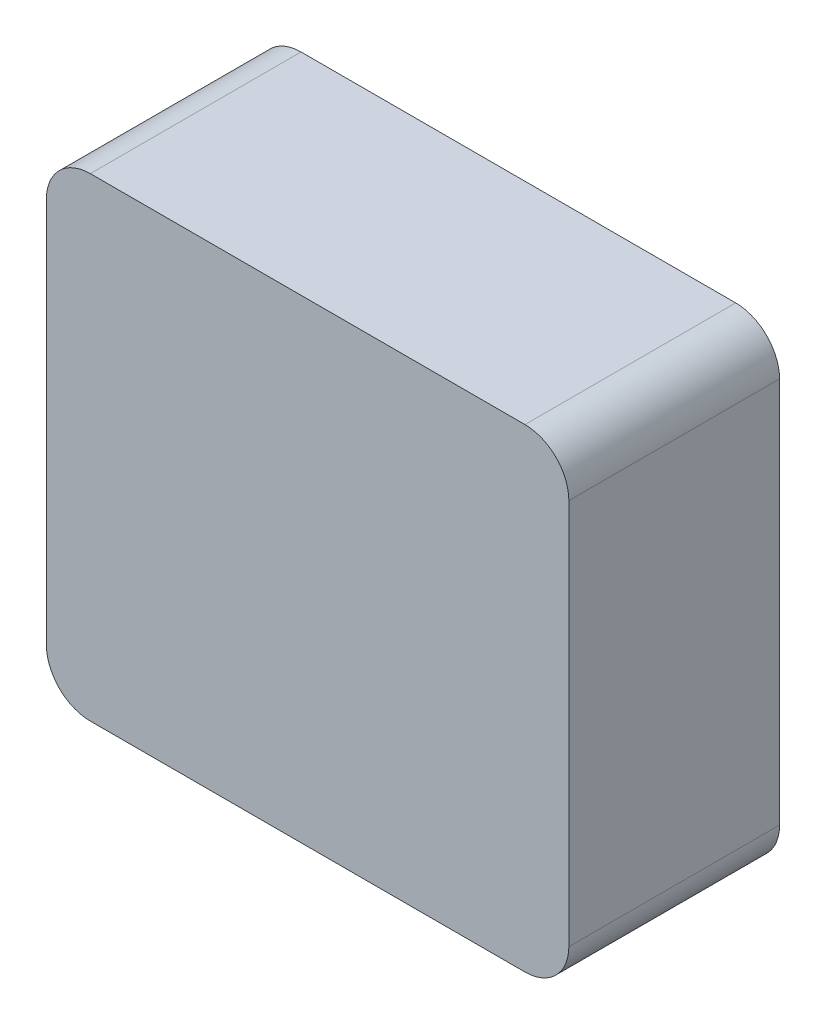
ISO-10303-21;
HEADER;
FILE_DESCRIPTION(('STEP AP214'),'2;1');
FILE_NAME('part.step','',(''),(''),'','','');
FILE_SCHEMA(('AUTOMOTIVE_DESIGN { 1 0 10303 214 1 1 1 1 }'));
ENDSEC;
DATA;
#1=APPLICATION_CONTEXT('core data for automotive mechanical design processes');
#2=APPLICATION_PROTOCOL_DEFINITION('international standard','automotive_design',2000,#1);
#3=PRODUCT_CONTEXT('',#1,'mechanical');
#4=PRODUCT('Part','Part','',(#3));
#5=PRODUCT_RELATED_PRODUCT_CATEGORY('part','',(#4));
#6=PRODUCT_DEFINITION_FORMATION('','',#4);
#7=PRODUCT_DEFINITION_CONTEXT('part definition',#1,'design');
#8=PRODUCT_DEFINITION('design','',#6,#7);
#9=PRODUCT_DEFINITION_SHAPE('','',#8);
#10=(LENGTH_UNIT() NAMED_UNIT(*) SI_UNIT(.MILLI.,.METRE.));
#11=(NAMED_UNIT(*) PLANE_ANGLE_UNIT() SI_UNIT($,.RADIAN.));
#12=(NAMED_UNIT(*) SI_UNIT($,.STERADIAN.) SOLID_ANGLE_UNIT());
#13=UNCERTAINTY_MEASURE_WITH_UNIT(LENGTH_MEASURE(1.E-05),#10,'distance_accuracy_value','');
#14=(GEOMETRIC_REPRESENTATION_CONTEXT(3) GLOBAL_UNCERTAINTY_ASSIGNED_CONTEXT((#13)) GLOBAL_UNIT_ASSIGNED_CONTEXT((#10,
#11,#12)) REPRESENTATION_CONTEXT('',''));
#15=CARTESIAN_POINT('',(0.,0.,0.));
#16=DIRECTION('',(0.,0.,1.));
#17=DIRECTION('',(1.,0.,0.));
#18=AXIS2_PLACEMENT_3D('',#15,#16,#17);
#19=CARTESIAN_POINT('',(0.,0.,96.));
#20=DIRECTION('',(-1.,0.,0.));
#21=DIRECTION('',(0.,-1.,0.));
#22=AXIS2_PLACEMENT_3D('',#19,#20,#21);
#23=PLANE('',#22);
#24=DIRECTION('',(0.,1.,0.));
#25=VECTOR('',#24,1.);
#26=CARTESIAN_POINT('',(0.,0.,96.));
#27=LINE('',#26,#25);
#28=CARTESIAN_POINT('',(0.,-196.,96.));
#29=VERTEX_POINT('',#28);
#30=CARTESIAN_POINT('',(0.,-20.,96.));
#31=VERTEX_POINT('',#30);
#32=EDGE_CURVE('E127',#29,#31,#27,.T.);
#33=ORIENTED_EDGE('',*,*,#32,.F.);
#34=DIRECTION('',(0.,0.,-1.));
#35=VECTOR('',#34,1.);
#36=CARTESIAN_POINT('',(0.,-196.,96.));
#37=LINE('',#36,#35);
#38=CARTESIAN_POINT('',(0.,-196.,0.));
#39=VERTEX_POINT('',#38);
#40=EDGE_CURVE('E11',#29,#39,#37,.T.);
#41=ORIENTED_EDGE('',*,*,#40,.T.);
#42=DIRECTION('',(0.,1.,0.));
#43=VECTOR('',#42,1.);
#44=CARTESIAN_POINT('',(0.,0.,0.));
#45=LINE('',#44,#43);
#46=CARTESIAN_POINT('',(0.,-20.,0.));
#47=VERTEX_POINT('',#46);
#48=EDGE_CURVE('E158',#39,#47,#45,.T.);
#49=ORIENTED_EDGE('',*,*,#48,.T.);
#50=DIRECTION('',(0.,0.,-1.));
#51=VECTOR('',#50,1.);
#52=CARTESIAN_POINT('',(0.,-20.,96.));
#53=LINE('',#52,#51);
#54=EDGE_CURVE('E41',#47,#31,#53,.F.);
#55=ORIENTED_EDGE('',*,*,#54,.T.);
#56=EDGE_LOOP('',(#33,#41,#49,#55));
#57=FACE_BOUND('',#56,.T.);
#58=ADVANCED_FACE('F33',(#57),#23,.F.);
#59=CARTESIAN_POINT('',(0.,0.,96.));
#60=DIRECTION('',(0.,-1.,0.));
#61=DIRECTION('',(1.,0.,0.));
#62=AXIS2_PLACEMENT_3D('',#59,#60,#61);
#63=PLANE('',#62);
#64=DIRECTION('',(-1.,0.,0.));
#65=VECTOR('',#64,1.);
#66=CARTESIAN_POINT('',(0.,0.,0.));
#67=LINE('',#66,#65);
#68=CARTESIAN_POINT('',(-20.,0.,0.));
#69=VERTEX_POINT('',#68);
#70=CARTESIAN_POINT('',(-218.,0.,0.));
#71=VERTEX_POINT('',#70);
#72=EDGE_CURVE('E132',#69,#71,#67,.T.);
#73=ORIENTED_EDGE('',*,*,#72,.T.);
#74=DIRECTION('',(0.,0.,-1.));
#75=VECTOR('',#74,1.);
#76=CARTESIAN_POINT('',(-218.,0.,96.));
#77=LINE('',#76,#75);
#78=CARTESIAN_POINT('',(-218.,0.,96.));
#79=VERTEX_POINT('',#78);
#80=EDGE_CURVE('E48',#71,#79,#77,.F.);
#81=ORIENTED_EDGE('',*,*,#80,.T.);
#82=DIRECTION('',(-1.,0.,0.));
#83=VECTOR('',#82,1.);
#84=CARTESIAN_POINT('',(0.,0.,96.));
#85=LINE('',#84,#83);
#86=CARTESIAN_POINT('',(-20.,0.,96.));
#87=VERTEX_POINT('',#86);
#88=EDGE_CURVE('E130',#87,#79,#85,.T.);
#89=ORIENTED_EDGE('',*,*,#88,.F.);
#90=DIRECTION('',(0.,0.,-1.));
#91=VECTOR('',#90,1.);
#92=CARTESIAN_POINT('',(-20.,0.,96.));
#93=LINE('',#92,#91);
#94=EDGE_CURVE('E150',#87,#69,#93,.T.);
#95=ORIENTED_EDGE('',*,*,#94,.T.);
#96=EDGE_LOOP('',(#73,#81,#89,#95));
#97=FACE_BOUND('',#96,.T.);
#98=ADVANCED_FACE('F165',(#97),#63,.F.);
#99=CARTESIAN_POINT('',(-238.,0.,96.));
#100=DIRECTION('',(1.,0.,0.));
#101=DIRECTION('',(0.,1.,0.));
#102=AXIS2_PLACEMENT_3D('',#99,#100,#101);
#103=PLANE('',#102);
#104=DIRECTION('',(0.,-1.,0.));
#105=VECTOR('',#104,1.);
#106=CARTESIAN_POINT('',(-238.,0.,0.));
#107=LINE('',#106,#105);
#108=CARTESIAN_POINT('',(-238.,-20.,0.));
#109=VERTEX_POINT('',#108);
#110=CARTESIAN_POINT('',(-238.,-196.,0.));
#111=VERTEX_POINT('',#110);
#112=EDGE_CURVE('E128',#109,#111,#107,.T.);
#113=ORIENTED_EDGE('',*,*,#112,.T.);
#114=DIRECTION('',(0.,0.,-1.));
#115=VECTOR('',#114,1.);
#116=CARTESIAN_POINT('',(-238.,-196.,96.));
#117=LINE('',#116,#115);
#118=CARTESIAN_POINT('',(-238.,-196.,96.));
#119=VERTEX_POINT('',#118);
#120=EDGE_CURVE('E105',#111,#119,#117,.F.);
#121=ORIENTED_EDGE('',*,*,#120,.T.);
#122=DIRECTION('',(0.,-1.,0.));
#123=VECTOR('',#122,1.);
#124=CARTESIAN_POINT('',(-238.,0.,96.));
#125=LINE('',#124,#123);
#126=CARTESIAN_POINT('',(-238.,-20.,96.));
#127=VERTEX_POINT('',#126);
#128=EDGE_CURVE('E169',#127,#119,#125,.T.);
#129=ORIENTED_EDGE('',*,*,#128,.F.);
#130=DIRECTION('',(0.,0.,-1.));
#131=VECTOR('',#130,1.);
#132=CARTESIAN_POINT('',(-238.,-20.,96.));
#133=LINE('',#132,#131);
#134=EDGE_CURVE('E110',#127,#109,#133,.T.);
#135=ORIENTED_EDGE('',*,*,#134,.T.);
#136=EDGE_LOOP('',(#113,#121,#129,#135));
#137=FACE_BOUND('',#136,.T.);
#138=ADVANCED_FACE('F177',(#137),#103,.F.);
#139=CARTESIAN_POINT('',(0.,-216.,96.));
#140=DIRECTION('',(0.,1.,0.));
#141=DIRECTION('',(-1.,0.,0.));
#142=AXIS2_PLACEMENT_3D('',#139,#140,#141);
#143=PLANE('',#142);
#144=DIRECTION('',(1.,0.,0.));
#145=VECTOR('',#144,1.);
#146=CARTESIAN_POINT('',(0.,-216.,96.));
#147=LINE('',#146,#145);
#148=CARTESIAN_POINT('',(-218.,-216.,96.));
#149=VERTEX_POINT('',#148);
#150=CARTESIAN_POINT('',(-20.,-216.,96.));
#151=VERTEX_POINT('',#150);
#152=EDGE_CURVE('E120',#149,#151,#147,.T.);
#153=ORIENTED_EDGE('',*,*,#152,.F.);
#154=DIRECTION('',(0.,0.,-1.));
#155=VECTOR('',#154,1.);
#156=CARTESIAN_POINT('',(-218.,-216.,96.));
#157=LINE('',#156,#155);
#158=CARTESIAN_POINT('',(-218.,-216.,0.));
#159=VERTEX_POINT('',#158);
#160=EDGE_CURVE('E104',#149,#159,#157,.T.);
#161=ORIENTED_EDGE('',*,*,#160,.T.);
#162=DIRECTION('',(1.,0.,0.));
#163=VECTOR('',#162,1.);
#164=CARTESIAN_POINT('',(0.,-216.,0.));
#165=LINE('',#164,#163);
#166=CARTESIAN_POINT('',(-20.,-216.,0.));
#167=VERTEX_POINT('',#166);
#168=EDGE_CURVE('E117',#159,#167,#165,.T.);
#169=ORIENTED_EDGE('',*,*,#168,.T.);
#170=DIRECTION('',(0.,0.,-1.));
#171=VECTOR('',#170,1.);
#172=CARTESIAN_POINT('',(-20.,-216.,96.));
#173=LINE('',#172,#171);
#174=EDGE_CURVE('E122',#167,#151,#173,.F.);
#175=ORIENTED_EDGE('',*,*,#174,.T.);
#176=EDGE_LOOP('',(#153,#161,#169,#175));
#177=FACE_BOUND('',#176,.T.);
#178=ADVANCED_FACE('F116',(#177),#143,.F.);
#179=CARTESIAN_POINT('',(0.,0.,96.));
#180=DIRECTION('',(0.,0.,-1.));
#181=DIRECTION('',(-1.,0.,0.));
#182=AXIS2_PLACEMENT_3D('',#179,#180,#181);
#183=PLANE('',#182);
#184=ORIENTED_EDGE('',*,*,#128,.T.);
#185=CARTESIAN_POINT('',(-218.,-196.,96.));
#186=DIRECTION('',(0.,0.,-1.));
#187=DIRECTION('',(-1.,0.,0.));
#188=AXIS2_PLACEMENT_3D('',#185,#186,#187);
#189=CIRCLE('',#188,20.);
#190=EDGE_CURVE('E148',#119,#149,#189,.F.);
#191=ORIENTED_EDGE('',*,*,#190,.T.);
#192=ORIENTED_EDGE('',*,*,#152,.T.);
#193=CARTESIAN_POINT('',(-20.,-196.,96.));
#194=DIRECTION('',(0.,0.,-1.));
#195=DIRECTION('',(-1.,0.,0.));
#196=AXIS2_PLACEMENT_3D('',#193,#194,#195);
#197=CIRCLE('',#196,20.);
#198=EDGE_CURVE('E144',#151,#29,#197,.F.);
#199=ORIENTED_EDGE('',*,*,#198,.T.);
#200=ORIENTED_EDGE('',*,*,#32,.T.);
#201=CARTESIAN_POINT('',(-20.,-20.,96.));
#202=DIRECTION('',(0.,0.,-1.));
#203=DIRECTION('',(-1.,0.,0.));
#204=AXIS2_PLACEMENT_3D('',#201,#202,#203);
#205=CIRCLE('',#204,20.);
#206=EDGE_CURVE('E55',#31,#87,#205,.F.);
#207=ORIENTED_EDGE('',*,*,#206,.T.);
#208=ORIENTED_EDGE('',*,*,#88,.T.);
#209=CARTESIAN_POINT('',(-218.,-20.,96.));
#210=DIRECTION('',(0.,0.,-1.));
#211=DIRECTION('',(-1.,0.,0.));
#212=AXIS2_PLACEMENT_3D('',#209,#210,#211);
#213=CIRCLE('',#212,20.);
#214=EDGE_CURVE('E146',#79,#127,#213,.F.);
#215=ORIENTED_EDGE('',*,*,#214,.T.);
#216=EDGE_LOOP('',(#184,#191,#192,#199,#200,#207,#208,#215));
#217=FACE_BOUND('',#216,.T.);
#218=ADVANCED_FACE('F161',(#217),#183,.F.);
#219=CARTESIAN_POINT('',(0.,0.,0.));
#220=DIRECTION('',(0.,0.,-1.));
#221=DIRECTION('',(-1.,0.,0.));
#222=AXIS2_PLACEMENT_3D('',#219,#220,#221);
#223=PLANE('',#222);
#224=ORIENTED_EDGE('',*,*,#168,.F.);
#225=CARTESIAN_POINT('',(-218.,-196.,0.));
#226=DIRECTION('',(0.,0.,-1.));
#227=DIRECTION('',(-1.,0.,0.));
#228=AXIS2_PLACEMENT_3D('',#225,#226,#227);
#229=CIRCLE('',#228,20.);
#230=EDGE_CURVE('E100',#159,#111,#229,.T.);
#231=ORIENTED_EDGE('',*,*,#230,.T.);
#232=ORIENTED_EDGE('',*,*,#112,.F.);
#233=CARTESIAN_POINT('',(-218.,-20.,0.));
#234=DIRECTION('',(0.,0.,-1.));
#235=DIRECTION('',(-1.,0.,0.));
#236=AXIS2_PLACEMENT_3D('',#233,#234,#235);
#237=CIRCLE('',#236,20.);
#238=EDGE_CURVE('E111',#109,#71,#237,.T.);
#239=ORIENTED_EDGE('',*,*,#238,.T.);
#240=ORIENTED_EDGE('',*,*,#72,.F.);
#241=CARTESIAN_POINT('',(-20.,-20.,0.));
#242=DIRECTION('',(0.,0.,-1.));
#243=DIRECTION('',(-1.,0.,0.));
#244=AXIS2_PLACEMENT_3D('',#241,#242,#243);
#245=CIRCLE('',#244,20.);
#246=EDGE_CURVE('E121',#69,#47,#245,.T.);
#247=ORIENTED_EDGE('',*,*,#246,.T.);
#248=ORIENTED_EDGE('',*,*,#48,.F.);
#249=CARTESIAN_POINT('',(-20.,-196.,0.));
#250=DIRECTION('',(0.,0.,-1.));
#251=DIRECTION('',(-1.,0.,0.));
#252=AXIS2_PLACEMENT_3D('',#249,#250,#251);
#253=CIRCLE('',#252,20.);
#254=EDGE_CURVE('E126',#39,#167,#253,.T.);
#255=ORIENTED_EDGE('',*,*,#254,.T.);
#256=EDGE_LOOP('',(#224,#231,#232,#239,#240,#247,#248,#255));
#257=FACE_BOUND('',#256,.T.);
#258=ADVANCED_FACE('F124',(#257),#223,.T.);
#259=CARTESIAN_POINT('',(-218.,-196.,96.));
#260=DIRECTION('',(0.,0.,-1.));
#261=DIRECTION('',(-1.,0.,0.));
#262=AXIS2_PLACEMENT_3D('',#259,#260,#261);
#263=CYLINDRICAL_SURFACE('',#262,20.);
#264=ORIENTED_EDGE('',*,*,#190,.F.);
#265=ORIENTED_EDGE('',*,*,#120,.F.);
#266=ORIENTED_EDGE('',*,*,#230,.F.);
#267=ORIENTED_EDGE('',*,*,#160,.F.);
#268=EDGE_LOOP('',(#264,#265,#266,#267));
#269=FACE_BOUND('',#268,.T.);
#270=ADVANCED_FACE('F103',(#269),#263,.T.);
#271=CARTESIAN_POINT('',(-218.,-20.,96.));
#272=DIRECTION('',(0.,0.,-1.));
#273=DIRECTION('',(-1.,0.,0.));
#274=AXIS2_PLACEMENT_3D('',#271,#272,#273);
#275=CYLINDRICAL_SURFACE('',#274,20.);
#276=ORIENTED_EDGE('',*,*,#214,.F.);
#277=ORIENTED_EDGE('',*,*,#80,.F.);
#278=ORIENTED_EDGE('',*,*,#238,.F.);
#279=ORIENTED_EDGE('',*,*,#134,.F.);
#280=EDGE_LOOP('',(#276,#277,#278,#279));
#281=FACE_BOUND('',#280,.T.);
#282=ADVANCED_FACE('F175',(#281),#275,.T.);
#283=CARTESIAN_POINT('',(-20.,-196.,96.));
#284=DIRECTION('',(0.,0.,-1.));
#285=DIRECTION('',(-1.,0.,0.));
#286=AXIS2_PLACEMENT_3D('',#283,#284,#285);
#287=CYLINDRICAL_SURFACE('',#286,20.);
#288=ORIENTED_EDGE('',*,*,#198,.F.);
#289=ORIENTED_EDGE('',*,*,#174,.F.);
#290=ORIENTED_EDGE('',*,*,#254,.F.);
#291=ORIENTED_EDGE('',*,*,#40,.F.);
#292=EDGE_LOOP('',(#288,#289,#290,#291));
#293=FACE_BOUND('',#292,.T.);
#294=ADVANCED_FACE('F179',(#293),#287,.T.);
#295=CARTESIAN_POINT('',(-20.,-20.,96.));
#296=DIRECTION('',(0.,0.,-1.));
#297=DIRECTION('',(-1.,0.,0.));
#298=AXIS2_PLACEMENT_3D('',#295,#296,#297);
#299=CYLINDRICAL_SURFACE('',#298,20.);
#300=ORIENTED_EDGE('',*,*,#206,.F.);
#301=ORIENTED_EDGE('',*,*,#54,.F.);
#302=ORIENTED_EDGE('',*,*,#246,.F.);
#303=ORIENTED_EDGE('',*,*,#94,.F.);
#304=EDGE_LOOP('',(#300,#301,#302,#303));
#305=FACE_BOUND('',#304,.T.);
#306=ADVANCED_FACE('F35',(#305),#299,.T.);
#307=CLOSED_SHELL('',(#58,#98,#138,#178,#218,#258,#270,#282,#294,#306));
#308=MANIFOLD_SOLID_BREP('B2',#307);
#309=ADVANCED_BREP_SHAPE_REPRESENTATION('',(#18,#308),#14);
#310=SHAPE_DEFINITION_REPRESENTATION(#9,#309);
ENDSEC;
END-ISO-10303-21;
